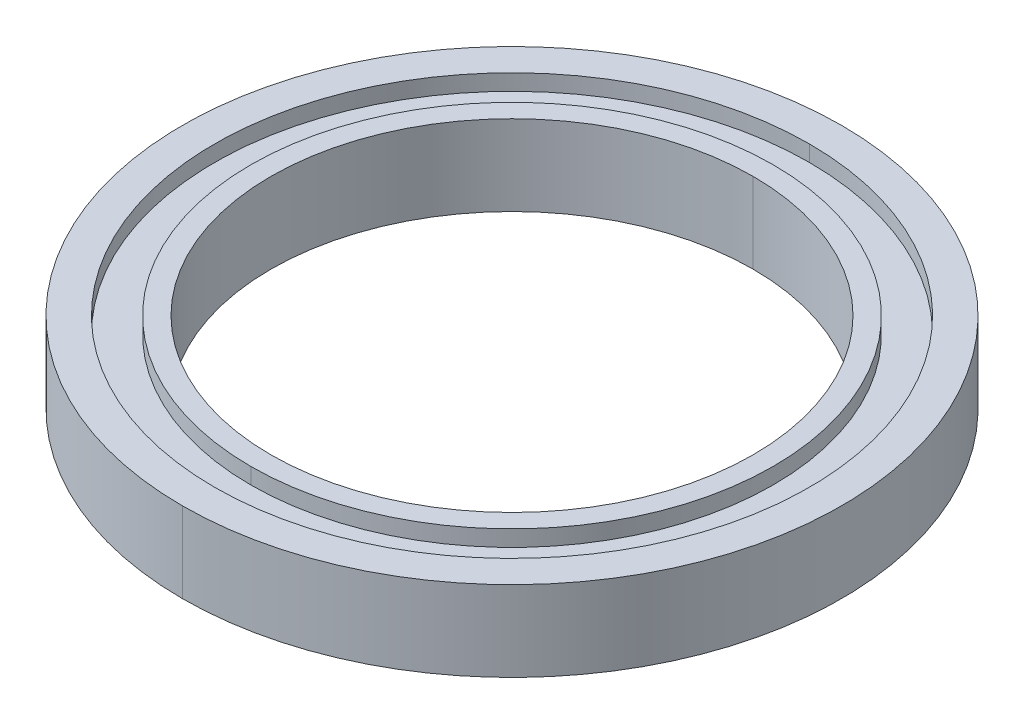
ISO-10303-21;
HEADER;
FILE_DESCRIPTION(('STEP AP214'),'2;1');
FILE_NAME('part.step','',(''),(''),'','','');
FILE_SCHEMA(('AUTOMOTIVE_DESIGN { 1 0 10303 214 1 1 1 1 }'));
ENDSEC;
DATA;
#1=APPLICATION_CONTEXT('core data for automotive mechanical design processes');
#2=APPLICATION_PROTOCOL_DEFINITION('international standard','automotive_design',2000,#1);
#3=PRODUCT_CONTEXT('',#1,'mechanical');
#4=PRODUCT('Part','Part','',(#3));
#5=PRODUCT_RELATED_PRODUCT_CATEGORY('part','',(#4));
#6=PRODUCT_DEFINITION_FORMATION('','',#4);
#7=PRODUCT_DEFINITION_CONTEXT('part definition',#1,'design');
#8=PRODUCT_DEFINITION('design','',#6,#7);
#9=PRODUCT_DEFINITION_SHAPE('','',#8);
#10=(LENGTH_UNIT() NAMED_UNIT(*) SI_UNIT(.MILLI.,.METRE.));
#11=(NAMED_UNIT(*) PLANE_ANGLE_UNIT() SI_UNIT($,.RADIAN.));
#12=(NAMED_UNIT(*) SI_UNIT($,.STERADIAN.) SOLID_ANGLE_UNIT());
#13=UNCERTAINTY_MEASURE_WITH_UNIT(LENGTH_MEASURE(1.E-05),#10,'distance_accuracy_value','');
#14=(GEOMETRIC_REPRESENTATION_CONTEXT(3) GLOBAL_UNCERTAINTY_ASSIGNED_CONTEXT((#13)) GLOBAL_UNIT_ASSIGNED_CONTEXT((#10,
#11,#12)) REPRESENTATION_CONTEXT('',''));
#15=CARTESIAN_POINT('',(0.,0.,0.));
#16=DIRECTION('',(0.,0.,1.));
#17=DIRECTION('',(1.,0.,0.));
#18=AXIS2_PLACEMENT_3D('',#15,#16,#17);
#19=CARTESIAN_POINT('',(0.,11.196883253564,0.));
#20=DIRECTION('',(0.,1.,0.));
#21=DIRECTION('',(0.,0.,1.));
#22=AXIS2_PLACEMENT_3D('',#19,#20,#21);
#23=CYLINDRICAL_SURFACE('',#22,16.25);
#24=DIRECTION('',(0.,1.,0.));
#25=VECTOR('',#24,1.);
#26=CARTESIAN_POINT('',(0.,11.196883253564,-16.25));
#27=LINE('',#26,#25);
#28=CARTESIAN_POINT('',(0.,0.,-16.25));
#29=VERTEX_POINT('',#28);
#30=CARTESIAN_POINT('',(0.,1.,-16.25));
#31=VERTEX_POINT('',#30);
#32=EDGE_CURVE('E219',#29,#31,#27,.T.);
#33=ORIENTED_EDGE('',*,*,#32,.F.);
#34=CARTESIAN_POINT('',(0.,0.,0.));
#35=DIRECTION('',(0.,1.,0.));
#36=DIRECTION('',(0.,0.,1.));
#37=AXIS2_PLACEMENT_3D('',#34,#35,#36);
#38=CIRCLE('',#37,16.25);
#39=CARTESIAN_POINT('',(0.,0.,16.25));
#40=VERTEX_POINT('',#39);
#41=EDGE_CURVE('E77',#29,#40,#38,.T.);
#42=ORIENTED_EDGE('',*,*,#41,.T.);
#43=DIRECTION('',(0.,1.,0.));
#44=VECTOR('',#43,1.);
#45=CARTESIAN_POINT('',(0.,11.196883253564,16.25));
#46=LINE('',#45,#44);
#47=CARTESIAN_POINT('',(0.,1.,16.25));
#48=VERTEX_POINT('',#47);
#49=EDGE_CURVE('E208',#40,#48,#46,.T.);
#50=ORIENTED_EDGE('',*,*,#49,.T.);
#51=CARTESIAN_POINT('',(0.,1.,0.));
#52=DIRECTION('',(0.,1.,0.));
#53=DIRECTION('',(0.,0.,1.));
#54=AXIS2_PLACEMENT_3D('',#51,#52,#53);
#55=CIRCLE('',#54,16.25);
#56=EDGE_CURVE('E11',#31,#48,#55,.T.);
#57=ORIENTED_EDGE('',*,*,#56,.F.);
#58=EDGE_LOOP('',(#33,#42,#50,#57));
#59=FACE_BOUND('',#58,.T.);
#60=ADVANCED_FACE('F17',(#59),#23,.T.);
#61=CARTESIAN_POINT('',(18.5,1.,0.));
#62=DIRECTION('',(0.,1.,0.));
#63=DIRECTION('',(1.,0.,0.));
#64=AXIS2_PLACEMENT_3D('',#61,#62,#63);
#65=PLANE('',#64);
#66=CARTESIAN_POINT('',(0.,1.,0.));
#67=DIRECTION('',(0.,1.,0.));
#68=DIRECTION('',(0.,0.,1.));
#69=AXIS2_PLACEMENT_3D('',#66,#67,#68);
#70=CIRCLE('',#69,16.25);
#71=EDGE_CURVE('E213',#48,#31,#70,.T.);
#72=ORIENTED_EDGE('',*,*,#71,.T.);
#73=ORIENTED_EDGE('',*,*,#56,.T.);
#74=EDGE_LOOP('',(#72,#73));
#75=FACE_BOUND('',#74,.T.);
#76=CARTESIAN_POINT('',(0.,1.,0.));
#77=DIRECTION('',(0.,1.,0.));
#78=DIRECTION('',(0.,0.,1.));
#79=AXIS2_PLACEMENT_3D('',#76,#77,#78);
#80=CIRCLE('',#79,18.5);
#81=CARTESIAN_POINT('',(0.,1.,18.5));
#82=VERTEX_POINT('',#81);
#83=CARTESIAN_POINT('',(0.,1.,-18.5));
#84=VERTEX_POINT('',#83);
#85=EDGE_CURVE('E26',#82,#84,#80,.T.);
#86=ORIENTED_EDGE('',*,*,#85,.F.);
#87=CARTESIAN_POINT('',(0.,1.,0.));
#88=DIRECTION('',(0.,1.,0.));
#89=DIRECTION('',(0.,0.,1.));
#90=AXIS2_PLACEMENT_3D('',#87,#88,#89);
#91=CIRCLE('',#90,18.5);
#92=EDGE_CURVE('E196',#84,#82,#91,.T.);
#93=ORIENTED_EDGE('',*,*,#92,.F.);
#94=EDGE_LOOP('',(#86,#93));
#95=FACE_BOUND('',#94,.T.);
#96=ADVANCED_FACE('F197',(#75,#95),#65,.F.);
#97=CARTESIAN_POINT('',(0.,11.196883253564,0.));
#98=DIRECTION('',(0.,1.,0.));
#99=DIRECTION('',(0.,0.,1.));
#100=AXIS2_PLACEMENT_3D('',#97,#98,#99);
#101=CYLINDRICAL_SURFACE('',#100,18.5);
#102=DIRECTION('',(0.,1.,0.));
#103=VECTOR('',#102,1.);
#104=CARTESIAN_POINT('',(0.,11.196883253564,-18.5));
#105=LINE('',#104,#103);
#106=CARTESIAN_POINT('',(0.,0.,-18.5));
#107=VERTEX_POINT('',#106);
#108=EDGE_CURVE('E187',#107,#84,#105,.T.);
#109=ORIENTED_EDGE('',*,*,#108,.F.);
#110=CARTESIAN_POINT('',(0.,0.,0.));
#111=DIRECTION('',(0.,1.,0.));
#112=DIRECTION('',(0.,0.,1.));
#113=AXIS2_PLACEMENT_3D('',#110,#111,#112);
#114=CIRCLE('',#113,18.5);
#115=CARTESIAN_POINT('',(0.,0.,18.5));
#116=VERTEX_POINT('',#115);
#117=EDGE_CURVE('E115',#116,#107,#114,.T.);
#118=ORIENTED_EDGE('',*,*,#117,.F.);
#119=DIRECTION('',(0.,1.,0.));
#120=VECTOR('',#119,1.);
#121=CARTESIAN_POINT('',(0.,11.196883253564,18.5));
#122=LINE('',#121,#120);
#123=EDGE_CURVE('E114',#116,#82,#122,.T.);
#124=ORIENTED_EDGE('',*,*,#123,.T.);
#125=ORIENTED_EDGE('',*,*,#85,.T.);
#126=EDGE_LOOP('',(#109,#118,#124,#125));
#127=FACE_BOUND('',#126,.T.);
#128=ADVANCED_FACE('F183',(#127),#101,.F.);
#129=CARTESIAN_POINT('',(20.5,0.,0.));
#130=DIRECTION('',(0.,1.,0.));
#131=DIRECTION('',(1.,0.,0.));
#132=AXIS2_PLACEMENT_3D('',#129,#130,#131);
#133=PLANE('',#132);
#134=ORIENTED_EDGE('',*,*,#117,.T.);
#135=CARTESIAN_POINT('',(0.,0.,0.));
#136=DIRECTION('',(0.,1.,0.));
#137=DIRECTION('',(0.,0.,1.));
#138=AXIS2_PLACEMENT_3D('',#135,#136,#137);
#139=CIRCLE('',#138,18.5);
#140=EDGE_CURVE('E203',#107,#116,#139,.T.);
#141=ORIENTED_EDGE('',*,*,#140,.T.);
#142=EDGE_LOOP('',(#134,#141));
#143=FACE_BOUND('',#142,.T.);
#144=CARTESIAN_POINT('',(0.,0.,0.));
#145=DIRECTION('',(0.,1.,0.));
#146=DIRECTION('',(0.,0.,1.));
#147=AXIS2_PLACEMENT_3D('',#144,#145,#146);
#148=CIRCLE('',#147,20.5);
#149=CARTESIAN_POINT('',(0.,0.,20.5));
#150=VERTEX_POINT('',#149);
#151=CARTESIAN_POINT('',(0.,0.,-20.5));
#152=VERTEX_POINT('',#151);
#153=EDGE_CURVE('E109',#150,#152,#148,.T.);
#154=ORIENTED_EDGE('',*,*,#153,.F.);
#155=CARTESIAN_POINT('',(0.,0.,0.));
#156=DIRECTION('',(0.,1.,0.));
#157=DIRECTION('',(0.,0.,1.));
#158=AXIS2_PLACEMENT_3D('',#155,#156,#157);
#159=CIRCLE('',#158,20.5);
#160=EDGE_CURVE('E119',#152,#150,#159,.T.);
#161=ORIENTED_EDGE('',*,*,#160,.F.);
#162=EDGE_LOOP('',(#154,#161));
#163=FACE_BOUND('',#162,.T.);
#164=ADVANCED_FACE('F383',(#143,#163),#133,.F.);
#165=CARTESIAN_POINT('',(0.,11.196883253564,0.));
#166=DIRECTION('',(0.,1.,0.));
#167=DIRECTION('',(0.,0.,1.));
#168=AXIS2_PLACEMENT_3D('',#165,#166,#167);
#169=CYLINDRICAL_SURFACE('',#168,20.5);
#170=DIRECTION('',(0.,1.,0.));
#171=VECTOR('',#170,1.);
#172=CARTESIAN_POINT('',(0.,11.196883253564,-20.5));
#173=LINE('',#172,#171);
#174=CARTESIAN_POINT('',(0.,5.,-20.5));
#175=VERTEX_POINT('',#174);
#176=EDGE_CURVE('E113',#152,#175,#173,.T.);
#177=ORIENTED_EDGE('',*,*,#176,.F.);
#178=ORIENTED_EDGE('',*,*,#160,.T.);
#179=DIRECTION('',(0.,1.,0.));
#180=VECTOR('',#179,1.);
#181=CARTESIAN_POINT('',(0.,11.196883253564,20.5));
#182=LINE('',#181,#180);
#183=CARTESIAN_POINT('',(0.,5.,20.5));
#184=VERTEX_POINT('',#183);
#185=EDGE_CURVE('E101',#150,#184,#182,.T.);
#186=ORIENTED_EDGE('',*,*,#185,.T.);
#187=CARTESIAN_POINT('',(0.,5.,0.));
#188=DIRECTION('',(0.,1.,0.));
#189=DIRECTION('',(0.,0.,1.));
#190=AXIS2_PLACEMENT_3D('',#187,#188,#189);
#191=CIRCLE('',#190,20.5);
#192=EDGE_CURVE('E167',#175,#184,#191,.T.);
#193=ORIENTED_EDGE('',*,*,#192,.F.);
#194=EDGE_LOOP('',(#177,#178,#186,#193));
#195=FACE_BOUND('',#194,.T.);
#196=ADVANCED_FACE('F387',(#195),#169,.T.);
#197=CARTESIAN_POINT('',(18.5,5.,0.));
#198=DIRECTION('',(0.,-1.,0.));
#199=DIRECTION('',(0.,0.,-1.));
#200=AXIS2_PLACEMENT_3D('',#197,#198,#199);
#201=PLANE('',#200);
#202=CARTESIAN_POINT('',(0.,5.,0.));
#203=DIRECTION('',(0.,1.,0.));
#204=DIRECTION('',(0.,0.,1.));
#205=AXIS2_PLACEMENT_3D('',#202,#203,#204);
#206=CIRCLE('',#205,18.5);
#207=CARTESIAN_POINT('',(0.,5.,18.5));
#208=VERTEX_POINT('',#207);
#209=CARTESIAN_POINT('',(0.,5.,-18.5));
#210=VERTEX_POINT('',#209);
#211=EDGE_CURVE('E163',#208,#210,#206,.T.);
#212=ORIENTED_EDGE('',*,*,#211,.F.);
#213=CARTESIAN_POINT('',(0.,5.,0.));
#214=DIRECTION('',(0.,1.,0.));
#215=DIRECTION('',(0.,0.,1.));
#216=AXIS2_PLACEMENT_3D('',#213,#214,#215);
#217=CIRCLE('',#216,18.5);
#218=EDGE_CURVE('E108',#210,#208,#217,.T.);
#219=ORIENTED_EDGE('',*,*,#218,.F.);
#220=EDGE_LOOP('',(#212,#219));
#221=FACE_BOUND('',#220,.T.);
#222=CARTESIAN_POINT('',(0.,5.,0.));
#223=DIRECTION('',(0.,1.,0.));
#224=DIRECTION('',(0.,0.,1.));
#225=AXIS2_PLACEMENT_3D('',#222,#223,#224);
#226=CIRCLE('',#225,20.5);
#227=EDGE_CURVE('E123',#184,#175,#226,.T.);
#228=ORIENTED_EDGE('',*,*,#227,.T.);
#229=ORIENTED_EDGE('',*,*,#192,.T.);
#230=EDGE_LOOP('',(#228,#229));
#231=FACE_BOUND('',#230,.T.);
#232=ADVANCED_FACE('F292',(#221,#231),#201,.F.);
#233=CARTESIAN_POINT('',(0.,11.196883253564,0.));
#234=DIRECTION('',(0.,1.,0.));
#235=DIRECTION('',(0.,0.,1.));
#236=AXIS2_PLACEMENT_3D('',#233,#234,#235);
#237=CYLINDRICAL_SURFACE('',#236,18.5);
#238=DIRECTION('',(0.,1.,0.));
#239=VECTOR('',#238,1.);
#240=CARTESIAN_POINT('',(0.,11.196883253564,-18.5));
#241=LINE('',#240,#239);
#242=CARTESIAN_POINT('',(0.,4.,-18.5));
#243=VERTEX_POINT('',#242);
#244=EDGE_CURVE('E131',#243,#210,#241,.T.);
#245=ORIENTED_EDGE('',*,*,#244,.F.);
#246=CARTESIAN_POINT('',(0.,4.,0.));
#247=DIRECTION('',(0.,1.,0.));
#248=DIRECTION('',(0.,0.,1.));
#249=AXIS2_PLACEMENT_3D('',#246,#247,#248);
#250=CIRCLE('',#249,18.5);
#251=CARTESIAN_POINT('',(0.,4.,18.5));
#252=VERTEX_POINT('',#251);
#253=EDGE_CURVE('E159',#252,#243,#250,.T.);
#254=ORIENTED_EDGE('',*,*,#253,.F.);
#255=DIRECTION('',(0.,1.,0.));
#256=VECTOR('',#255,1.);
#257=CARTESIAN_POINT('',(0.,11.196883253564,18.5));
#258=LINE('',#257,#256);
#259=EDGE_CURVE('E103',#252,#208,#258,.T.);
#260=ORIENTED_EDGE('',*,*,#259,.T.);
#261=ORIENTED_EDGE('',*,*,#211,.T.);
#262=EDGE_LOOP('',(#245,#254,#260,#261));
#263=FACE_BOUND('',#262,.T.);
#264=ADVANCED_FACE('F245',(#263),#237,.F.);
#265=CARTESIAN_POINT('',(16.25,4.,0.));
#266=DIRECTION('',(0.,-1.,0.));
#267=DIRECTION('',(0.,0.,-1.));
#268=AXIS2_PLACEMENT_3D('',#265,#266,#267);
#269=PLANE('',#268);
#270=CARTESIAN_POINT('',(0.,4.,0.));
#271=DIRECTION('',(0.,1.,0.));
#272=DIRECTION('',(0.,0.,1.));
#273=AXIS2_PLACEMENT_3D('',#270,#271,#272);
#274=CIRCLE('',#273,16.25);
#275=CARTESIAN_POINT('',(0.,4.,16.25));
#276=VERTEX_POINT('',#275);
#277=CARTESIAN_POINT('',(0.,4.,-16.25));
#278=VERTEX_POINT('',#277);
#279=EDGE_CURVE('E107',#276,#278,#274,.T.);
#280=ORIENTED_EDGE('',*,*,#279,.F.);
#281=CARTESIAN_POINT('',(0.,4.,0.));
#282=DIRECTION('',(0.,1.,0.));
#283=DIRECTION('',(0.,0.,1.));
#284=AXIS2_PLACEMENT_3D('',#281,#282,#283);
#285=CIRCLE('',#284,16.25);
#286=EDGE_CURVE('E155',#278,#276,#285,.T.);
#287=ORIENTED_EDGE('',*,*,#286,.F.);
#288=EDGE_LOOP('',(#280,#287));
#289=FACE_BOUND('',#288,.T.);
#290=ORIENTED_EDGE('',*,*,#253,.T.);
#291=CARTESIAN_POINT('',(0.,4.,0.));
#292=DIRECTION('',(0.,1.,0.));
#293=DIRECTION('',(0.,0.,1.));
#294=AXIS2_PLACEMENT_3D('',#291,#292,#293);
#295=CIRCLE('',#294,18.5);
#296=EDGE_CURVE('E127',#243,#252,#295,.T.);
#297=ORIENTED_EDGE('',*,*,#296,.T.);
#298=EDGE_LOOP('',(#290,#297));
#299=FACE_BOUND('',#298,.T.);
#300=ADVANCED_FACE('F281',(#289,#299),#269,.F.);
#301=CARTESIAN_POINT('',(0.,11.196883253564,0.));
#302=DIRECTION('',(0.,1.,0.));
#303=DIRECTION('',(0.,0.,1.));
#304=AXIS2_PLACEMENT_3D('',#301,#302,#303);
#305=CYLINDRICAL_SURFACE('',#304,16.25);
#306=DIRECTION('',(0.,1.,0.));
#307=VECTOR('',#306,1.);
#308=CARTESIAN_POINT('',(0.,11.196883253564,-16.25));
#309=LINE('',#308,#307);
#310=CARTESIAN_POINT('',(0.,5.,-16.25));
#311=VERTEX_POINT('',#310);
#312=EDGE_CURVE('E138',#278,#311,#309,.T.);
#313=ORIENTED_EDGE('',*,*,#312,.F.);
#314=ORIENTED_EDGE('',*,*,#286,.T.);
#315=DIRECTION('',(0.,1.,0.));
#316=VECTOR('',#315,1.);
#317=CARTESIAN_POINT('',(0.,11.196883253564,16.25));
#318=LINE('',#317,#316);
#319=CARTESIAN_POINT('',(0.,5.,16.25));
#320=VERTEX_POINT('',#319);
#321=EDGE_CURVE('E88',#276,#320,#318,.T.);
#322=ORIENTED_EDGE('',*,*,#321,.T.);
#323=CARTESIAN_POINT('',(0.,5.,0.));
#324=DIRECTION('',(0.,1.,0.));
#325=DIRECTION('',(0.,0.,1.));
#326=AXIS2_PLACEMENT_3D('',#323,#324,#325);
#327=CIRCLE('',#326,16.25);
#328=EDGE_CURVE('E152',#311,#320,#327,.T.);
#329=ORIENTED_EDGE('',*,*,#328,.F.);
#330=EDGE_LOOP('',(#313,#314,#322,#329));
#331=FACE_BOUND('',#330,.T.);
#332=ADVANCED_FACE('F275',(#331),#305,.T.);
#333=CARTESIAN_POINT('',(15.,5.,0.));
#334=DIRECTION('',(0.,-1.,0.));
#335=DIRECTION('',(0.,0.,-1.));
#336=AXIS2_PLACEMENT_3D('',#333,#334,#335);
#337=PLANE('',#336);
#338=CARTESIAN_POINT('',(0.,5.,0.));
#339=DIRECTION('',(0.,1.,0.));
#340=DIRECTION('',(0.,0.,1.));
#341=AXIS2_PLACEMENT_3D('',#338,#339,#340);
#342=CIRCLE('',#341,15.);
#343=CARTESIAN_POINT('',(0.,5.,15.));
#344=VERTEX_POINT('',#343);
#345=CARTESIAN_POINT('',(0.,5.,-15.));
#346=VERTEX_POINT('',#345);
#347=EDGE_CURVE('E38',#344,#346,#342,.T.);
#348=ORIENTED_EDGE('',*,*,#347,.F.);
#349=CARTESIAN_POINT('',(0.,5.,0.));
#350=DIRECTION('',(0.,1.,0.));
#351=DIRECTION('',(0.,0.,1.));
#352=AXIS2_PLACEMENT_3D('',#349,#350,#351);
#353=CIRCLE('',#352,15.);
#354=EDGE_CURVE('E82',#346,#344,#353,.T.);
#355=ORIENTED_EDGE('',*,*,#354,.F.);
#356=EDGE_LOOP('',(#348,#355));
#357=FACE_BOUND('',#356,.T.);
#358=CARTESIAN_POINT('',(0.,5.,0.));
#359=DIRECTION('',(0.,1.,0.));
#360=DIRECTION('',(0.,0.,1.));
#361=AXIS2_PLACEMENT_3D('',#358,#359,#360);
#362=CIRCLE('',#361,16.25);
#363=EDGE_CURVE('E97',#320,#311,#362,.T.);
#364=ORIENTED_EDGE('',*,*,#363,.T.);
#365=ORIENTED_EDGE('',*,*,#328,.T.);
#366=EDGE_LOOP('',(#364,#365));
#367=FACE_BOUND('',#366,.T.);
#368=ADVANCED_FACE('F290',(#357,#367),#337,.F.);
#369=CARTESIAN_POINT('',(0.,11.196883253564,0.));
#370=DIRECTION('',(0.,1.,0.));
#371=DIRECTION('',(0.,0.,1.));
#372=AXIS2_PLACEMENT_3D('',#369,#370,#371);
#373=CYLINDRICAL_SURFACE('',#372,15.);
#374=DIRECTION('',(0.,1.,0.));
#375=VECTOR('',#374,1.);
#376=CARTESIAN_POINT('',(0.,11.196883253564,-15.));
#377=LINE('',#376,#375);
#378=CARTESIAN_POINT('',(0.,0.,-15.));
#379=VERTEX_POINT('',#378);
#380=EDGE_CURVE('E72',#379,#346,#377,.T.);
#381=ORIENTED_EDGE('',*,*,#380,.F.);
#382=CARTESIAN_POINT('',(0.,0.,0.));
#383=DIRECTION('',(0.,1.,0.));
#384=DIRECTION('',(0.,0.,1.));
#385=AXIS2_PLACEMENT_3D('',#382,#383,#384);
#386=CIRCLE('',#385,15.);
#387=CARTESIAN_POINT('',(0.,0.,15.));
#388=VERTEX_POINT('',#387);
#389=EDGE_CURVE('E66',#388,#379,#386,.T.);
#390=ORIENTED_EDGE('',*,*,#389,.F.);
#391=DIRECTION('',(0.,1.,0.));
#392=VECTOR('',#391,1.);
#393=CARTESIAN_POINT('',(0.,11.196883253564,15.));
#394=LINE('',#393,#392);
#395=EDGE_CURVE('E69',#388,#344,#394,.T.);
#396=ORIENTED_EDGE('',*,*,#395,.T.);
#397=ORIENTED_EDGE('',*,*,#347,.T.);
#398=EDGE_LOOP('',(#381,#390,#396,#397));
#399=FACE_BOUND('',#398,.T.);
#400=ADVANCED_FACE('F68',(#399),#373,.F.);
#401=CARTESIAN_POINT('',(16.25,0.,0.));
#402=DIRECTION('',(0.,1.,0.));
#403=DIRECTION('',(1.,0.,0.));
#404=AXIS2_PLACEMENT_3D('',#401,#402,#403);
#405=PLANE('',#404);
#406=ORIENTED_EDGE('',*,*,#389,.T.);
#407=CARTESIAN_POINT('',(0.,0.,0.));
#408=DIRECTION('',(0.,1.,0.));
#409=DIRECTION('',(0.,0.,1.));
#410=AXIS2_PLACEMENT_3D('',#407,#408,#409);
#411=CIRCLE('',#410,15.);
#412=EDGE_CURVE('E81',#379,#388,#411,.T.);
#413=ORIENTED_EDGE('',*,*,#412,.T.);
#414=EDGE_LOOP('',(#406,#413));
#415=FACE_BOUND('',#414,.T.);
#416=CARTESIAN_POINT('',(0.,0.,0.));
#417=DIRECTION('',(0.,1.,0.));
#418=DIRECTION('',(0.,0.,1.));
#419=AXIS2_PLACEMENT_3D('',#416,#417,#418);
#420=CIRCLE('',#419,16.25);
#421=EDGE_CURVE('E224',#40,#29,#420,.T.);
#422=ORIENTED_EDGE('',*,*,#421,.F.);
#423=ORIENTED_EDGE('',*,*,#41,.F.);
#424=EDGE_LOOP('',(#422,#423));
#425=FACE_BOUND('',#424,.T.);
#426=ADVANCED_FACE('F85',(#415,#425),#405,.F.);
#427=CARTESIAN_POINT('',(0.,11.196883253564,0.));
#428=DIRECTION('',(0.,1.,0.));
#429=DIRECTION('',(0.,0.,1.));
#430=AXIS2_PLACEMENT_3D('',#427,#428,#429);
#431=CYLINDRICAL_SURFACE('',#430,15.);
#432=ORIENTED_EDGE('',*,*,#412,.F.);
#433=ORIENTED_EDGE('',*,*,#380,.T.);
#434=ORIENTED_EDGE('',*,*,#354,.T.);
#435=ORIENTED_EDGE('',*,*,#395,.F.);
#436=EDGE_LOOP('',(#432,#433,#434,#435));
#437=FACE_BOUND('',#436,.T.);
#438=ADVANCED_FACE('F80',(#437),#431,.F.);
#439=CARTESIAN_POINT('',(0.,11.196883253564,0.));
#440=DIRECTION('',(0.,1.,0.));
#441=DIRECTION('',(0.,0.,1.));
#442=AXIS2_PLACEMENT_3D('',#439,#440,#441);
#443=CYLINDRICAL_SURFACE('',#442,16.25);
#444=ORIENTED_EDGE('',*,*,#279,.T.);
#445=ORIENTED_EDGE('',*,*,#312,.T.);
#446=ORIENTED_EDGE('',*,*,#363,.F.);
#447=ORIENTED_EDGE('',*,*,#321,.F.);
#448=EDGE_LOOP('',(#444,#445,#446,#447));
#449=FACE_BOUND('',#448,.T.);
#450=ADVANCED_FACE('F280',(#449),#443,.T.);
#451=CARTESIAN_POINT('',(0.,11.196883253564,0.));
#452=DIRECTION('',(0.,1.,0.));
#453=DIRECTION('',(0.,0.,1.));
#454=AXIS2_PLACEMENT_3D('',#451,#452,#453);
#455=CYLINDRICAL_SURFACE('',#454,18.5);
#456=ORIENTED_EDGE('',*,*,#296,.F.);
#457=ORIENTED_EDGE('',*,*,#244,.T.);
#458=ORIENTED_EDGE('',*,*,#218,.T.);
#459=ORIENTED_EDGE('',*,*,#259,.F.);
#460=EDGE_LOOP('',(#456,#457,#458,#459));
#461=FACE_BOUND('',#460,.T.);
#462=ADVANCED_FACE('F236',(#461),#455,.F.);
#463=CARTESIAN_POINT('',(0.,11.196883253564,0.));
#464=DIRECTION('',(0.,1.,0.));
#465=DIRECTION('',(0.,0.,1.));
#466=AXIS2_PLACEMENT_3D('',#463,#464,#465);
#467=CYLINDRICAL_SURFACE('',#466,20.5);
#468=ORIENTED_EDGE('',*,*,#153,.T.);
#469=ORIENTED_EDGE('',*,*,#176,.T.);
#470=ORIENTED_EDGE('',*,*,#227,.F.);
#471=ORIENTED_EDGE('',*,*,#185,.F.);
#472=EDGE_LOOP('',(#468,#469,#470,#471));
#473=FACE_BOUND('',#472,.T.);
#474=ADVANCED_FACE('F444',(#473),#467,.T.);
#475=CARTESIAN_POINT('',(0.,11.196883253564,0.));
#476=DIRECTION('',(0.,1.,0.));
#477=DIRECTION('',(0.,0.,1.));
#478=AXIS2_PLACEMENT_3D('',#475,#476,#477);
#479=CYLINDRICAL_SURFACE('',#478,18.5);
#480=ORIENTED_EDGE('',*,*,#140,.F.);
#481=ORIENTED_EDGE('',*,*,#108,.T.);
#482=ORIENTED_EDGE('',*,*,#92,.T.);
#483=ORIENTED_EDGE('',*,*,#123,.F.);
#484=EDGE_LOOP('',(#480,#481,#482,#483));
#485=FACE_BOUND('',#484,.T.);
#486=ADVANCED_FACE('F201',(#485),#479,.F.);
#487=CARTESIAN_POINT('',(0.,11.196883253564,0.));
#488=DIRECTION('',(0.,1.,0.));
#489=DIRECTION('',(0.,0.,1.));
#490=AXIS2_PLACEMENT_3D('',#487,#488,#489);
#491=CYLINDRICAL_SURFACE('',#490,16.25);
#492=ORIENTED_EDGE('',*,*,#421,.T.);
#493=ORIENTED_EDGE('',*,*,#32,.T.);
#494=ORIENTED_EDGE('',*,*,#71,.F.);
#495=ORIENTED_EDGE('',*,*,#49,.F.);
#496=EDGE_LOOP('',(#492,#493,#494,#495));
#497=FACE_BOUND('',#496,.T.);
#498=ADVANCED_FACE('F314',(#497),#491,.T.);
#499=CLOSED_SHELL('',(#60,#96,#128,#164,#196,#232,#264,#300,#332,#368,#400,#426,#438,#450,#462,
#474,#486,#498));
#500=MANIFOLD_SOLID_BREP('B1',#499);
#501=ADVANCED_BREP_SHAPE_REPRESENTATION('',(#18,#500),#14);
#502=SHAPE_DEFINITION_REPRESENTATION(#9,#501);
ENDSEC;
END-ISO-10303-21;
